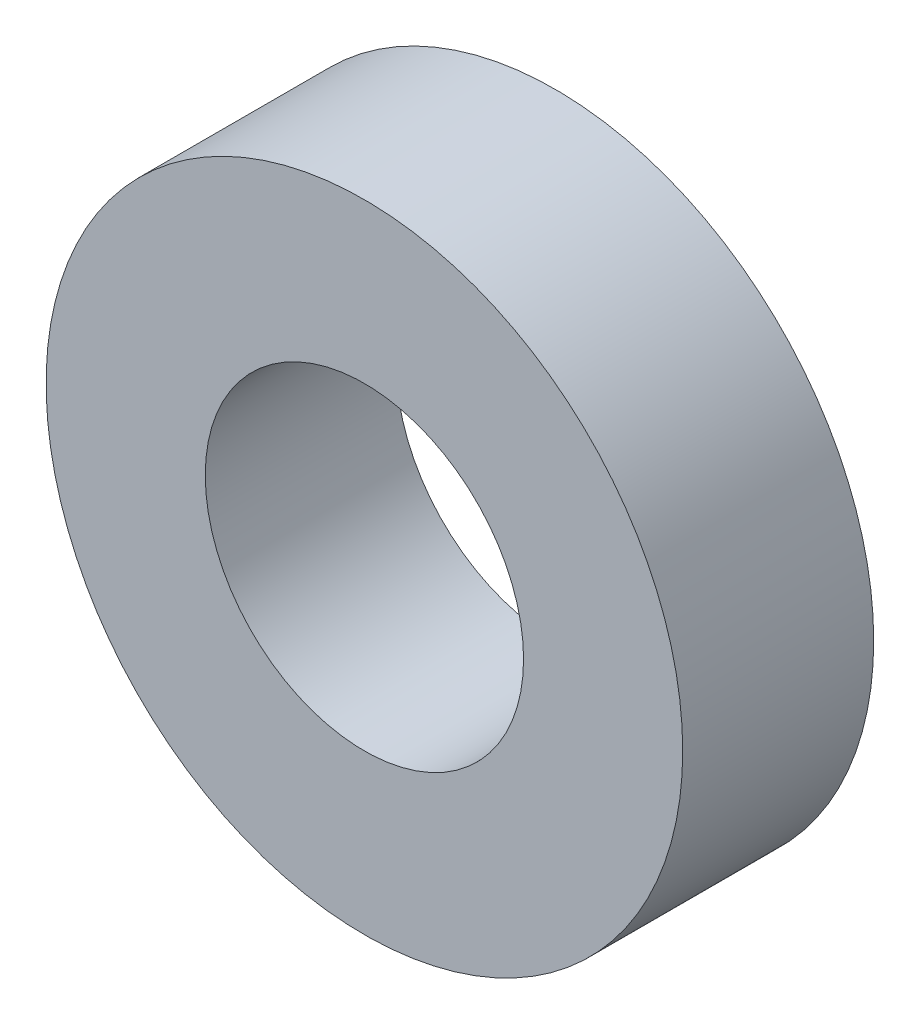
ISO-10303-21;
HEADER;
FILE_DESCRIPTION(('STEP AP214'),'2;1');
FILE_NAME('part.step','',(''),(''),'','','');
FILE_SCHEMA(('AUTOMOTIVE_DESIGN { 1 0 10303 214 1 1 1 1 }'));
ENDSEC;
DATA;
#1=APPLICATION_CONTEXT('core data for automotive mechanical design processes');
#2=APPLICATION_PROTOCOL_DEFINITION('international standard','automotive_design',2000,#1);
#3=PRODUCT_CONTEXT('',#1,'mechanical');
#4=PRODUCT('Part','Part','',(#3));
#5=PRODUCT_RELATED_PRODUCT_CATEGORY('part','',(#4));
#6=PRODUCT_DEFINITION_FORMATION('','',#4);
#7=PRODUCT_DEFINITION_CONTEXT('part definition',#1,'design');
#8=PRODUCT_DEFINITION('design','',#6,#7);
#9=PRODUCT_DEFINITION_SHAPE('','',#8);
#10=(LENGTH_UNIT() NAMED_UNIT(*) SI_UNIT(.MILLI.,.METRE.));
#11=(NAMED_UNIT(*) PLANE_ANGLE_UNIT() SI_UNIT($,.RADIAN.));
#12=(NAMED_UNIT(*) SI_UNIT($,.STERADIAN.) SOLID_ANGLE_UNIT());
#13=UNCERTAINTY_MEASURE_WITH_UNIT(LENGTH_MEASURE(1.E-05),#10,'distance_accuracy_value','');
#14=(GEOMETRIC_REPRESENTATION_CONTEXT(3) GLOBAL_UNCERTAINTY_ASSIGNED_CONTEXT((#13)) GLOBAL_UNIT_ASSIGNED_CONTEXT((#10,
#11,#12)) REPRESENTATION_CONTEXT('',''));
#15=CARTESIAN_POINT('',(0.,0.,0.));
#16=DIRECTION('',(0.,0.,1.));
#17=DIRECTION('',(1.,0.,0.));
#18=AXIS2_PLACEMENT_3D('',#15,#16,#17);
#19=CARTESIAN_POINT('',(0.,0.,3.));
#20=DIRECTION('',(0.,0.,1.));
#21=DIRECTION('',(1.,0.,0.));
#22=AXIS2_PLACEMENT_3D('',#19,#20,#21);
#23=PLANE('',#22);
#24=CARTESIAN_POINT('',(0.,0.,3.));
#25=DIRECTION('',(0.,0.,1.));
#26=DIRECTION('',(1.,0.,0.));
#27=AXIS2_PLACEMENT_3D('',#24,#25,#26);
#28=CIRCLE('',#27,5.);
#29=CARTESIAN_POINT('',(5.,0.,3.));
#30=VERTEX_POINT('',#29);
#31=EDGE_CURVE('E10',#30,#30,#28,.T.);
#32=ORIENTED_EDGE('',*,*,#31,.T.);
#33=EDGE_LOOP('',(#32));
#34=FACE_BOUND('',#33,.T.);
#35=CARTESIAN_POINT('',(0.,0.,3.));
#36=DIRECTION('',(0.,0.,1.));
#37=DIRECTION('',(1.,0.,0.));
#38=AXIS2_PLACEMENT_3D('',#35,#36,#37);
#39=CIRCLE('',#38,2.5);
#40=CARTESIAN_POINT('',(2.5,0.,3.));
#41=VERTEX_POINT('',#40);
#42=EDGE_CURVE('E50',#41,#41,#39,.T.);
#43=ORIENTED_EDGE('',*,*,#42,.F.);
#44=EDGE_LOOP('',(#43));
#45=FACE_BOUND('',#44,.T.);
#46=ADVANCED_FACE('F37',(#34,#45),#23,.T.);
#47=CARTESIAN_POINT('',(0.,0.,0.));
#48=DIRECTION('',(0.,0.,1.));
#49=DIRECTION('',(1.,0.,0.));
#50=AXIS2_PLACEMENT_3D('',#47,#48,#49);
#51=PLANE('',#50);
#52=CARTESIAN_POINT('',(0.,0.,0.));
#53=DIRECTION('',(0.,0.,1.));
#54=DIRECTION('',(1.,0.,0.));
#55=AXIS2_PLACEMENT_3D('',#52,#53,#54);
#56=CIRCLE('',#55,5.);
#57=CARTESIAN_POINT('',(5.,0.,0.));
#58=VERTEX_POINT('',#57);
#59=EDGE_CURVE('E41',#58,#58,#56,.T.);
#60=ORIENTED_EDGE('',*,*,#59,.F.);
#61=EDGE_LOOP('',(#60));
#62=FACE_BOUND('',#61,.T.);
#63=CARTESIAN_POINT('',(0.,0.,0.));
#64=DIRECTION('',(0.,0.,1.));
#65=DIRECTION('',(1.,0.,0.));
#66=AXIS2_PLACEMENT_3D('',#63,#64,#65);
#67=CIRCLE('',#66,2.5);
#68=CARTESIAN_POINT('',(2.5,0.,0.));
#69=VERTEX_POINT('',#68);
#70=EDGE_CURVE('E52',#69,#69,#67,.T.);
#71=ORIENTED_EDGE('',*,*,#70,.T.);
#72=EDGE_LOOP('',(#71));
#73=FACE_BOUND('',#72,.T.);
#74=ADVANCED_FACE('F64',(#62,#73),#51,.F.);
#75=CARTESIAN_POINT('',(0.,0.,3.));
#76=DIRECTION('',(0.,0.,-1.));
#77=DIRECTION('',(-1.,0.,0.));
#78=AXIS2_PLACEMENT_3D('',#75,#76,#77);
#79=CYLINDRICAL_SURFACE('',#78,5.);
#80=ORIENTED_EDGE('',*,*,#31,.F.);
#81=EDGE_LOOP('',(#80));
#82=FACE_BOUND('',#81,.T.);
#83=ORIENTED_EDGE('',*,*,#59,.T.);
#84=EDGE_LOOP('',(#83));
#85=FACE_BOUND('',#84,.T.);
#86=ADVANCED_FACE('F39',(#82,#85),#79,.T.);
#87=CARTESIAN_POINT('',(0.,0.,3.));
#88=DIRECTION('',(0.,0.,-1.));
#89=DIRECTION('',(-1.,0.,0.));
#90=AXIS2_PLACEMENT_3D('',#87,#88,#89);
#91=CYLINDRICAL_SURFACE('',#90,2.5);
#92=ORIENTED_EDGE('',*,*,#42,.T.);
#93=EDGE_LOOP('',(#92));
#94=FACE_BOUND('',#93,.T.);
#95=ORIENTED_EDGE('',*,*,#70,.F.);
#96=EDGE_LOOP('',(#95));
#97=FACE_BOUND('',#96,.T.);
#98=ADVANCED_FACE('F60',(#94,#97),#91,.F.);
#99=CLOSED_SHELL('',(#46,#74,#86,#98));
#100=MANIFOLD_SOLID_BREP('B2',#99);
#101=ADVANCED_BREP_SHAPE_REPRESENTATION('',(#18,#100),#14);
#102=SHAPE_DEFINITION_REPRESENTATION(#9,#101);
ENDSEC;
END-ISO-10303-21;
